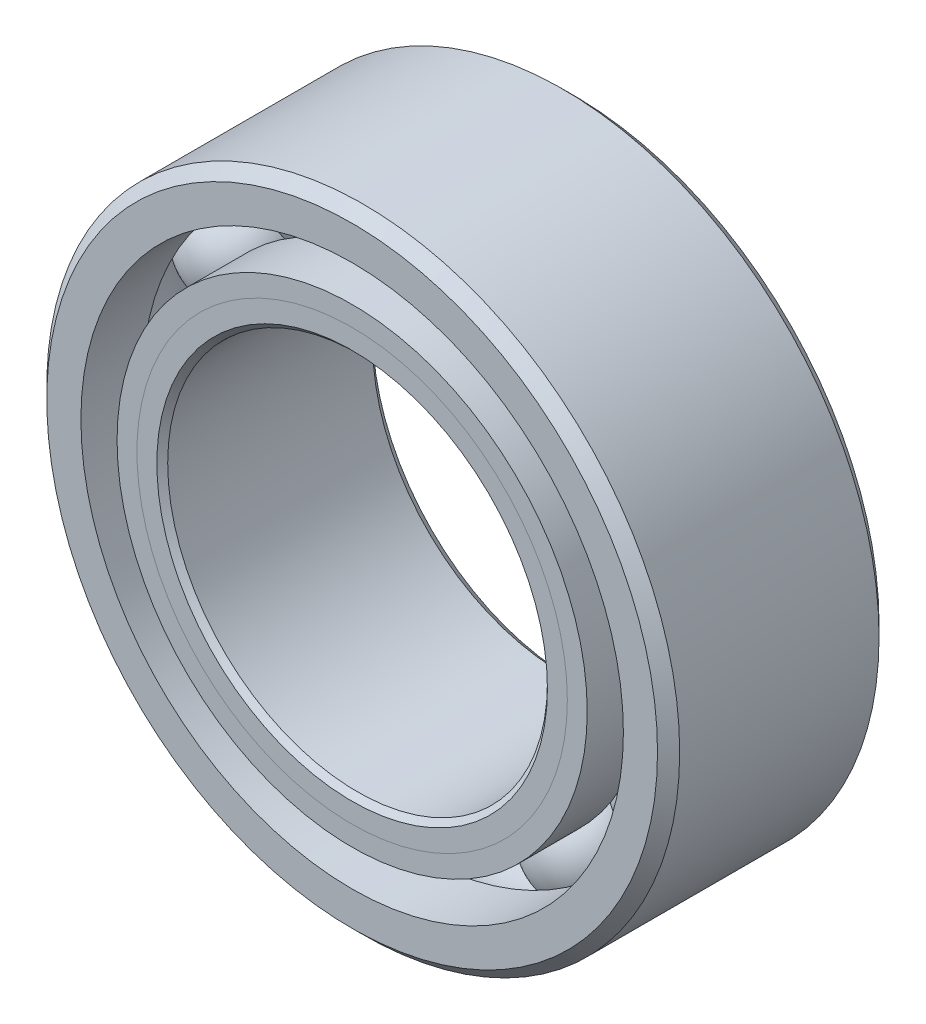
ISO-10303-21;
HEADER;
FILE_DESCRIPTION(('STEP AP214'),'2;1');
FILE_NAME('part.step','',(''),(''),'','','');
FILE_SCHEMA(('AUTOMOTIVE_DESIGN { 1 0 10303 214 1 1 1 1 }'));
ENDSEC;
DATA;
#1=APPLICATION_CONTEXT('core data for automotive mechanical design processes');
#2=APPLICATION_PROTOCOL_DEFINITION('international standard','automotive_design',2000,#1);
#3=PRODUCT_CONTEXT('',#1,'mechanical');
#4=PRODUCT('Part','Part','',(#3));
#5=PRODUCT_RELATED_PRODUCT_CATEGORY('part','',(#4));
#6=PRODUCT_DEFINITION_FORMATION('','',#4);
#7=PRODUCT_DEFINITION_CONTEXT('part definition',#1,'design');
#8=PRODUCT_DEFINITION('design','',#6,#7);
#9=PRODUCT_DEFINITION_SHAPE('','',#8);
#10=(LENGTH_UNIT() NAMED_UNIT(*) SI_UNIT(.MILLI.,.METRE.));
#11=(NAMED_UNIT(*) PLANE_ANGLE_UNIT() SI_UNIT($,.RADIAN.));
#12=(NAMED_UNIT(*) SI_UNIT($,.STERADIAN.) SOLID_ANGLE_UNIT());
#13=UNCERTAINTY_MEASURE_WITH_UNIT(LENGTH_MEASURE(1.E-05),#10,'distance_accuracy_value','');
#14=(GEOMETRIC_REPRESENTATION_CONTEXT(3) GLOBAL_UNCERTAINTY_ASSIGNED_CONTEXT((#13)) GLOBAL_UNIT_ASSIGNED_CONTEXT((#10,
#11,#12)) REPRESENTATION_CONTEXT('',''));
#15=CARTESIAN_POINT('',(0.,0.,0.));
#16=DIRECTION('',(0.,0.,1.));
#17=DIRECTION('',(1.,0.,0.));
#18=AXIS2_PLACEMENT_3D('',#15,#16,#17);
#19=CARTESIAN_POINT('',(-1.58749999999996,2.74963065701561,0.));
#20=DIRECTION('',(0.,0.,1.));
#21=DIRECTION('',(-0.499999999999989,0.866025403784445,0.));
#22=AXIS2_PLACEMENT_3D('',#19,#20,#21);
#23=SPHERICAL_SURFACE('',#22,0.657697880273631);
#24=CARTESIAN_POINT('',(-1.58749999999996,2.74963065701561,0.65769788027363));
#25=VERTEX_POINT('',#24);
#26=VERTEX_LOOP('',#25);
#27=FACE_BOUND('',#26,.T.);
#28=ADVANCED_FACE('F41',(#27),#23,.T.);
#29=CLOSED_SHELL('',(#28));
#30=MANIFOLD_SOLID_BREP('B2',#29);
#31=CARTESIAN_POINT('',(-2.74963065701557,1.58750000000003,0.));
#32=DIRECTION('',(0.,0.,1.));
#33=DIRECTION('',(-0.866025403784433,0.50000000000001,0.));
#34=AXIS2_PLACEMENT_3D('',#31,#32,#33);
#35=SPHERICAL_SURFACE('',#34,0.657697880273631);
#36=CARTESIAN_POINT('',(-2.74963065701557,1.58750000000003,0.65769788027363));
#37=VERTEX_POINT('',#36);
#38=VERTEX_LOOP('',#37);
#39=FACE_BOUND('',#38,.T.);
#40=ADVANCED_FACE('F73',(#39),#35,.T.);
#41=CLOSED_SHELL('',(#40));
#42=MANIFOLD_SOLID_BREP('B6',#41);
#43=CARTESIAN_POINT('',(-3.175,0.,0.));
#44=DIRECTION('',(0.,0.,1.));
#45=DIRECTION('',(-1.,0.,0.));
#46=AXIS2_PLACEMENT_3D('',#43,#44,#45);
#47=SPHERICAL_SURFACE('',#46,0.657697880273631);
#48=CARTESIAN_POINT('',(-3.175,0.,0.65769788027363));
#49=VERTEX_POINT('',#48);
#50=VERTEX_LOOP('',#49);
#51=FACE_BOUND('',#50,.T.);
#52=ADVANCED_FACE('F105',(#51),#47,.T.);
#53=CLOSED_SHELL('',(#52));
#54=MANIFOLD_SOLID_BREP('B37',#53);
#55=CARTESIAN_POINT('',(-2.74963065701561,-1.58749999999997,0.));
#56=DIRECTION('',(0.,0.,1.));
#57=DIRECTION('',(-0.866025403784443,-0.499999999999992,0.));
#58=AXIS2_PLACEMENT_3D('',#55,#56,#57);
#59=SPHERICAL_SURFACE('',#58,0.657697880273631);
#60=CARTESIAN_POINT('',(-2.74963065701561,-1.58749999999997,0.65769788027363));
#61=VERTEX_POINT('',#60);
#62=VERTEX_LOOP('',#61);
#63=FACE_BOUND('',#62,.T.);
#64=ADVANCED_FACE('F137',(#63),#59,.T.);
#65=CLOSED_SHELL('',(#64));
#66=MANIFOLD_SOLID_BREP('B69',#65);
#67=CARTESIAN_POINT('',(-1.58750000000002,-2.74963065701558,0.));
#68=DIRECTION('',(0.,0.,1.));
#69=DIRECTION('',(-0.500000000000007,-0.866025403784435,0.));
#70=AXIS2_PLACEMENT_3D('',#67,#68,#69);
#71=SPHERICAL_SURFACE('',#70,0.657697880273631);
#72=CARTESIAN_POINT('',(-1.58750000000002,-2.74963065701558,0.65769788027363));
#73=VERTEX_POINT('',#72);
#74=VERTEX_LOOP('',#73);
#75=FACE_BOUND('',#74,.T.);
#76=ADVANCED_FACE('F169',(#75),#71,.T.);
#77=CLOSED_SHELL('',(#76));
#78=MANIFOLD_SOLID_BREP('B101',#77);
#79=CARTESIAN_POINT('',(0.,-3.175,0.));
#80=DIRECTION('',(0.,0.,1.));
#81=DIRECTION('',(0.,-1.,0.));
#82=AXIS2_PLACEMENT_3D('',#79,#80,#81);
#83=SPHERICAL_SURFACE('',#82,0.657697880273631);
#84=CARTESIAN_POINT('',(0.,-3.175,0.65769788027363));
#85=VERTEX_POINT('',#84);
#86=VERTEX_LOOP('',#85);
#87=FACE_BOUND('',#86,.T.);
#88=ADVANCED_FACE('F201',(#87),#83,.T.);
#89=CLOSED_SHELL('',(#88));
#90=MANIFOLD_SOLID_BREP('B133',#89);
#91=CARTESIAN_POINT('',(1.58749999999998,-2.7496306570156,0.));
#92=DIRECTION('',(0.,0.,1.));
#93=DIRECTION('',(0.499999999999995,-0.866025403784442,0.));
#94=AXIS2_PLACEMENT_3D('',#91,#92,#93);
#95=SPHERICAL_SURFACE('',#94,0.657697880273631);
#96=CARTESIAN_POINT('',(1.58749999999998,-2.7496306570156,0.65769788027363));
#97=VERTEX_POINT('',#96);
#98=VERTEX_LOOP('',#97);
#99=FACE_BOUND('',#98,.T.);
#100=ADVANCED_FACE('F232',(#99),#95,.T.);
#101=CLOSED_SHELL('',(#100));
#102=MANIFOLD_SOLID_BREP('B165',#101);
#103=CARTESIAN_POINT('',(2.74963065701559,-1.58750000000001,0.));
#104=DIRECTION('',(0.,0.,1.));
#105=DIRECTION('',(0.866025403784436,-0.500000000000004,0.));
#106=AXIS2_PLACEMENT_3D('',#103,#104,#105);
#107=SPHERICAL_SURFACE('',#106,0.657697880273631);
#108=CARTESIAN_POINT('',(2.74963065701559,-1.58750000000001,0.65769788027363));
#109=VERTEX_POINT('',#108);
#110=VERTEX_LOOP('',#109);
#111=FACE_BOUND('',#110,.T.);
#112=ADVANCED_FACE('F263',(#111),#107,.T.);
#113=CLOSED_SHELL('',(#112));
#114=MANIFOLD_SOLID_BREP('B197',#113);
#115=CARTESIAN_POINT('',(3.175,0.,0.));
#116=DIRECTION('',(0.,0.,1.));
#117=DIRECTION('',(1.,0.,0.));
#118=AXIS2_PLACEMENT_3D('',#115,#116,#117);
#119=SPHERICAL_SURFACE('',#118,0.657697880273631);
#120=CARTESIAN_POINT('',(3.175,0.,0.65769788027363));
#121=VERTEX_POINT('',#120);
#122=VERTEX_LOOP('',#121);
#123=FACE_BOUND('',#122,.T.);
#124=ADVANCED_FACE('F294',(#123),#119,.T.);
#125=CLOSED_SHELL('',(#124));
#126=MANIFOLD_SOLID_BREP('B228',#125);
#127=CARTESIAN_POINT('',(2.7496306570156,1.58749999999999,0.));
#128=DIRECTION('',(0.,0.,1.));
#129=DIRECTION('',(0.86602540378444,0.499999999999998,0.));
#130=AXIS2_PLACEMENT_3D('',#127,#128,#129);
#131=SPHERICAL_SURFACE('',#130,0.657697880273631);
#132=CARTESIAN_POINT('',(2.7496306570156,1.58749999999999,0.65769788027363));
#133=VERTEX_POINT('',#132);
#134=VERTEX_LOOP('',#133);
#135=FACE_BOUND('',#134,.T.);
#136=ADVANCED_FACE('F326',(#135),#131,.T.);
#137=CLOSED_SHELL('',(#136));
#138=MANIFOLD_SOLID_BREP('B259',#137);
#139=CARTESIAN_POINT('',(1.5875,2.74963065701559,0.));
#140=DIRECTION('',(0.,0.,1.));
#141=DIRECTION('',(0.500000000000001,0.866025403784438,0.));
#142=AXIS2_PLACEMENT_3D('',#139,#140,#141);
#143=SPHERICAL_SURFACE('',#142,0.657697880273631);
#144=CARTESIAN_POINT('',(1.5875,2.74963065701559,0.65769788027363));
#145=VERTEX_POINT('',#144);
#146=VERTEX_LOOP('',#145);
#147=FACE_BOUND('',#146,.T.);
#148=ADVANCED_FACE('F357',(#147),#143,.T.);
#149=CLOSED_SHELL('',(#148));
#150=MANIFOLD_SOLID_BREP('B290',#149);
#151=CARTESIAN_POINT('',(0.,3.175,0.));
#152=DIRECTION('',(0.,0.,1.));
#153=DIRECTION('',(0.,1.,0.));
#154=AXIS2_PLACEMENT_3D('',#151,#152,#153);
#155=SPHERICAL_SURFACE('',#154,0.657697880273631);
#156=CARTESIAN_POINT('',(0.,3.175,0.65769788027363));
#157=VERTEX_POINT('',#156);
#158=VERTEX_LOOP('',#157);
#159=FACE_BOUND('',#158,.T.);
#160=ADVANCED_FACE('F391',(#159),#155,.T.);
#161=CLOSED_SHELL('',(#160));
#162=MANIFOLD_SOLID_BREP('B322',#161);
#163=CARTESIAN_POINT('',(0.,2.69874517278874,1.3890625));
#164=DIRECTION('',(0.,0.,-1.));
#165=DIRECTION('',(-1.,0.,0.));
#166=AXIS2_PLACEMENT_3D('',#163,#164,#165);
#167=PLANE('',#166);
#168=CARTESIAN_POINT('',(0.,0.,1.3890625));
#169=DIRECTION('',(0.,0.,1.));
#170=DIRECTION('',(1.,0.,0.));
#171=AXIS2_PLACEMENT_3D('',#168,#169,#170);
#172=CIRCLE('',#171,2.44927605986318);
#173=CARTESIAN_POINT('',(2.44927605986318,0.,1.3890625));
#174=VERTEX_POINT('',#173);
#175=EDGE_CURVE('E456',#174,#174,#172,.T.);
#176=ORIENTED_EDGE('',*,*,#175,.F.);
#177=EDGE_LOOP('',(#176));
#178=FACE_BOUND('',#177,.T.);
#179=CARTESIAN_POINT('',(0.,0.,1.3890625));
#180=DIRECTION('',(0.,0.,1.));
#181=DIRECTION('',(1.,0.,0.));
#182=AXIS2_PLACEMENT_3D('',#179,#180,#181);
#183=CIRCLE('',#182,2.69874517278874);
#184=CARTESIAN_POINT('',(2.69874517278874,0.,1.3890625));
#185=VERTEX_POINT('',#184);
#186=EDGE_CURVE('E390',#185,#185,#183,.T.);
#187=ORIENTED_EDGE('',*,*,#186,.T.);
#188=EDGE_LOOP('',(#187));
#189=FACE_BOUND('',#188,.T.);
#190=ADVANCED_FACE('F412',(#178,#189),#167,.F.);
#191=CARTESIAN_POINT('',(0.,0.,1.13959338707445));
#192=DIRECTION('',(0.,0.,1.));
#193=DIRECTION('',(1.,0.,0.));
#194=AXIS2_PLACEMENT_3D('',#191,#192,#193);
#195=CONICAL_SURFACE('',#194,2.44927605986318,0.78539816339745);
#196=ORIENTED_EDGE('',*,*,#186,.F.);
#197=EDGE_LOOP('',(#196));
#198=FACE_BOUND('',#197,.T.);
#199=CARTESIAN_POINT('',(0.,0.,1.13959338707445));
#200=DIRECTION('',(0.,0.,1.));
#201=DIRECTION('',(1.,0.,0.));
#202=AXIS2_PLACEMENT_3D('',#199,#200,#201);
#203=CIRCLE('',#202,2.44927605986318);
#204=CARTESIAN_POINT('',(2.44927605986318,0.,1.13959338707445));
#205=VERTEX_POINT('',#204);
#206=EDGE_CURVE('E419',#205,#205,#203,.T.);
#207=ORIENTED_EDGE('',*,*,#206,.T.);
#208=EDGE_LOOP('',(#207));
#209=FACE_BOUND('',#208,.T.);
#210=ADVANCED_FACE('F463',(#198,#209),#195,.T.);
#211=CARTESIAN_POINT('',(0.,0.,1.3890625));
#212=DIRECTION('',(0.,0.,1.));
#213=DIRECTION('',(1.,0.,0.));
#214=AXIS2_PLACEMENT_3D('',#211,#212,#213);
#215=CYLINDRICAL_SURFACE('',#214,2.44927605986318);
#216=ORIENTED_EDGE('',*,*,#206,.F.);
#217=EDGE_LOOP('',(#216));
#218=FACE_BOUND('',#217,.T.);
#219=CARTESIAN_POINT('',(0.,0.,0.));
#220=DIRECTION('',(0.,0.,1.));
#221=DIRECTION('',(1.,0.,0.));
#222=AXIS2_PLACEMENT_3D('',#219,#220,#221);
#223=CIRCLE('',#222,2.44927605986318);
#224=CARTESIAN_POINT('',(2.44927605986318,0.,0.));
#225=VERTEX_POINT('',#224);
#226=EDGE_CURVE('E425',#225,#225,#223,.T.);
#227=ORIENTED_EDGE('',*,*,#226,.T.);
#228=EDGE_LOOP('',(#227));
#229=FACE_BOUND('',#228,.T.);
#230=ADVANCED_FACE('F467',(#218,#229),#215,.T.);
#231=CARTESIAN_POINT('',(0.,2.44927605986318,0.));
#232=DIRECTION('',(0.,0.,-1.));
#233=DIRECTION('',(-1.,0.,0.));
#234=AXIS2_PLACEMENT_3D('',#231,#232,#233);
#235=PLANE('',#234);
#236=ORIENTED_EDGE('',*,*,#226,.F.);
#237=EDGE_LOOP('',(#236));
#238=FACE_BOUND('',#237,.T.);
#239=CARTESIAN_POINT('',(0.,0.,0.));
#240=DIRECTION('',(0.,0.,1.));
#241=DIRECTION('',(1.,0.,0.));
#242=AXIS2_PLACEMENT_3D('',#239,#240,#241);
#243=CIRCLE('',#242,2.51730211972637);
#244=CARTESIAN_POINT('',(2.51730211972637,0.,0.));
#245=VERTEX_POINT('',#244);
#246=EDGE_CURVE('E432',#245,#245,#243,.T.);
#247=ORIENTED_EDGE('',*,*,#246,.T.);
#248=EDGE_LOOP('',(#247));
#249=FACE_BOUND('',#248,.T.);
#250=ADVANCED_FACE('F472',(#238,#249),#235,.F.);
#251=CARTESIAN_POINT('',(0.,0.,0.));
#252=DIRECTION('',(0.,0.,1.));
#253=DIRECTION('',(1.,0.,0.));
#254=AXIS2_PLACEMENT_3D('',#251,#252,#253);
#255=TOROIDAL_SURFACE('',#254,3.175,0.65769788027363);
#256=ORIENTED_EDGE('',*,*,#246,.F.);
#257=EDGE_LOOP('',(#256));
#258=FACE_BOUND('',#257,.T.);
#259=CARTESIAN_POINT('',(0.,0.,-0.617361111111111));
#260=DIRECTION('',(0.,0.,1.));
#261=DIRECTION('',(1.,0.,0.));
#262=AXIS2_PLACEMENT_3D('',#259,#260,#261);
#263=CIRCLE('',#262,2.94821428571429);
#264=CARTESIAN_POINT('',(2.94821428571429,0.,-0.617361111111111));
#265=VERTEX_POINT('',#264);
#266=EDGE_CURVE('E437',#265,#265,#263,.T.);
#267=ORIENTED_EDGE('',*,*,#266,.T.);
#268=EDGE_LOOP('',(#267));
#269=FACE_BOUND('',#268,.T.);
#270=ADVANCED_FACE('F478',(#258,#269),#255,.F.);
#271=CARTESIAN_POINT('',(0.,0.,1.3890625));
#272=DIRECTION('',(0.,0.,1.));
#273=DIRECTION('',(1.,0.,0.));
#274=AXIS2_PLACEMENT_3D('',#271,#272,#273);
#275=CYLINDRICAL_SURFACE('',#274,2.94821428571429);
#276=ORIENTED_EDGE('',*,*,#266,.F.);
#277=EDGE_LOOP('',(#276));
#278=FACE_BOUND('',#277,.T.);
#279=CARTESIAN_POINT('',(0.,0.,-1.3890625));
#280=DIRECTION('',(0.,0.,1.));
#281=DIRECTION('',(1.,0.,0.));
#282=AXIS2_PLACEMENT_3D('',#279,#280,#281);
#283=CIRCLE('',#282,2.94821428571429);
#284=CARTESIAN_POINT('',(2.94821428571429,0.,-1.3890625));
#285=VERTEX_POINT('',#284);
#286=EDGE_CURVE('E441',#285,#285,#283,.T.);
#287=ORIENTED_EDGE('',*,*,#286,.T.);
#288=EDGE_LOOP('',(#287));
#289=FACE_BOUND('',#288,.T.);
#290=ADVANCED_FACE('F482',(#278,#289),#275,.T.);
#291=CARTESIAN_POINT('',(0.,2.52015625,-1.3890625));
#292=DIRECTION('',(0.,0.,1.));
#293=DIRECTION('',(1.,0.,0.));
#294=AXIS2_PLACEMENT_3D('',#291,#292,#293);
#295=PLANE('',#294);
#296=ORIENTED_EDGE('',*,*,#286,.F.);
#297=EDGE_LOOP('',(#296));
#298=FACE_BOUND('',#297,.T.);
#299=CARTESIAN_POINT('',(0.,0.,-1.3890625));
#300=DIRECTION('',(0.,0.,1.));
#301=DIRECTION('',(1.,0.,0.));
#302=AXIS2_PLACEMENT_3D('',#299,#300,#301);
#303=CIRCLE('',#302,2.52015625);
#304=CARTESIAN_POINT('',(2.52015625,0.,-1.3890625));
#305=VERTEX_POINT('',#304);
#306=EDGE_CURVE('E445',#305,#305,#303,.T.);
#307=ORIENTED_EDGE('',*,*,#306,.T.);
#308=EDGE_LOOP('',(#307));
#309=FACE_BOUND('',#308,.T.);
#310=ADVANCED_FACE('F486',(#298,#309),#295,.F.);
#311=CARTESIAN_POINT('',(0.,0.,-1.25015625));
#312=DIRECTION('',(0.,0.,-1.));
#313=DIRECTION('',(-1.,0.,0.));
#314=AXIS2_PLACEMENT_3D('',#311,#312,#313);
#315=CONICAL_SURFACE('',#314,2.38125,0.78539816339745);
#316=ORIENTED_EDGE('',*,*,#306,.F.);
#317=EDGE_LOOP('',(#316));
#318=FACE_BOUND('',#317,.T.);
#319=CARTESIAN_POINT('',(0.,0.,-1.25015625));
#320=DIRECTION('',(0.,0.,1.));
#321=DIRECTION('',(1.,0.,0.));
#322=AXIS2_PLACEMENT_3D('',#319,#320,#321);
#323=CIRCLE('',#322,2.38125);
#324=CARTESIAN_POINT('',(2.38125,0.,-1.25015625));
#325=VERTEX_POINT('',#324);
#326=EDGE_CURVE('E449',#325,#325,#323,.T.);
#327=ORIENTED_EDGE('',*,*,#326,.T.);
#328=EDGE_LOOP('',(#327));
#329=FACE_BOUND('',#328,.T.);
#330=ADVANCED_FACE('F490',(#318,#329),#315,.F.);
#331=CARTESIAN_POINT('',(0.,0.,1.3890625));
#332=DIRECTION('',(0.,0.,1.));
#333=DIRECTION('',(1.,0.,0.));
#334=AXIS2_PLACEMENT_3D('',#331,#332,#333);
#335=CYLINDRICAL_SURFACE('',#334,2.38125);
#336=ORIENTED_EDGE('',*,*,#326,.F.);
#337=EDGE_LOOP('',(#336));
#338=FACE_BOUND('',#337,.T.);
#339=CARTESIAN_POINT('',(0.,0.,1.32103644013682));
#340=DIRECTION('',(0.,0.,1.));
#341=DIRECTION('',(1.,0.,0.));
#342=AXIS2_PLACEMENT_3D('',#339,#340,#341);
#343=CIRCLE('',#342,2.38125);
#344=CARTESIAN_POINT('',(2.38125,0.,1.32103644013682));
#345=VERTEX_POINT('',#344);
#346=EDGE_CURVE('E453',#345,#345,#343,.T.);
#347=ORIENTED_EDGE('',*,*,#346,.T.);
#348=EDGE_LOOP('',(#347));
#349=FACE_BOUND('',#348,.T.);
#350=ADVANCED_FACE('F494',(#338,#349),#335,.F.);
#351=CARTESIAN_POINT('',(0.,0.,1.3890625));
#352=DIRECTION('',(0.,0.,1.));
#353=DIRECTION('',(1.,0.,0.));
#354=AXIS2_PLACEMENT_3D('',#351,#352,#353);
#355=CONICAL_SURFACE('',#354,2.44927605986318,0.785398163397453);
#356=ORIENTED_EDGE('',*,*,#346,.F.);
#357=EDGE_LOOP('',(#356));
#358=FACE_BOUND('',#357,.T.);
#359=ORIENTED_EDGE('',*,*,#175,.T.);
#360=EDGE_LOOP('',(#359));
#361=FACE_BOUND('',#360,.T.);
#362=ADVANCED_FACE('F460',(#358,#361),#355,.F.);
#363=CLOSED_SHELL('',(#190,#210,#230,#250,#270,#290,#310,#330,#350,#362));
#364=MANIFOLD_SOLID_BREP('B353',#363);
#365=CARTESIAN_POINT('',(0.,2.94821428571429,1.3890625));
#366=DIRECTION('',(0.,0.,-1.));
#367=DIRECTION('',(-1.,0.,0.));
#368=AXIS2_PLACEMENT_3D('',#365,#366,#367);
#369=PLANE('',#368);
#370=CARTESIAN_POINT('',(0.,0.,1.3890625));
#371=DIRECTION('',(0.,0.,1.));
#372=DIRECTION('',(1.,0.,0.));
#373=AXIS2_PLACEMENT_3D('',#370,#371,#372);
#374=CIRCLE('',#373,2.69874517278874);
#375=CARTESIAN_POINT('',(2.69874517278874,0.,1.3890625));
#376=VERTEX_POINT('',#375);
#377=EDGE_CURVE('E411',#376,#376,#374,.T.);
#378=ORIENTED_EDGE('',*,*,#377,.F.);
#379=EDGE_LOOP('',(#378));
#380=FACE_BOUND('',#379,.T.);
#381=CARTESIAN_POINT('',(0.,0.,1.3890625));
#382=DIRECTION('',(0.,0.,1.));
#383=DIRECTION('',(1.,0.,0.));
#384=AXIS2_PLACEMENT_3D('',#381,#382,#383);
#385=CIRCLE('',#384,2.94821428571429);
#386=CARTESIAN_POINT('',(2.94821428571429,0.,1.3890625));
#387=VERTEX_POINT('',#386);
#388=EDGE_CURVE('E617',#387,#387,#385,.T.);
#389=ORIENTED_EDGE('',*,*,#388,.T.);
#390=EDGE_LOOP('',(#389));
#391=FACE_BOUND('',#390,.T.);
#392=ADVANCED_FACE('F589',(#380,#391),#369,.F.);
#393=CARTESIAN_POINT('',(0.,0.,1.3890625));
#394=DIRECTION('',(0.,0.,1.));
#395=DIRECTION('',(1.,0.,0.));
#396=AXIS2_PLACEMENT_3D('',#393,#394,#395);
#397=CONICAL_SURFACE('',#396,2.69874517278874,0.78539816339745);
#398=CARTESIAN_POINT('',(0.,0.,1.13959338707445));
#399=DIRECTION('',(0.,0.,1.));
#400=DIRECTION('',(1.,0.,0.));
#401=AXIS2_PLACEMENT_3D('',#398,#399,#400);
#402=CIRCLE('',#401,2.44927605986318);
#403=CARTESIAN_POINT('',(2.44927605986318,0.,1.13959338707445));
#404=VERTEX_POINT('',#403);
#405=EDGE_CURVE('E596',#404,#404,#402,.T.);
#406=ORIENTED_EDGE('',*,*,#405,.F.);
#407=EDGE_LOOP('',(#406));
#408=FACE_BOUND('',#407,.T.);
#409=ORIENTED_EDGE('',*,*,#377,.T.);
#410=EDGE_LOOP('',(#409));
#411=FACE_BOUND('',#410,.T.);
#412=ADVANCED_FACE('F642',(#408,#411),#397,.F.);
#413=CARTESIAN_POINT('',(0.,0.,1.3890625));
#414=DIRECTION('',(0.,0.,1.));
#415=DIRECTION('',(1.,0.,0.));
#416=AXIS2_PLACEMENT_3D('',#413,#414,#415);
#417=CYLINDRICAL_SURFACE('',#416,2.44927605986318);
#418=CARTESIAN_POINT('',(0.,0.,0.));
#419=DIRECTION('',(0.,0.,1.));
#420=DIRECTION('',(1.,0.,0.));
#421=AXIS2_PLACEMENT_3D('',#418,#419,#420);
#422=CIRCLE('',#421,2.44927605986318);
#423=CARTESIAN_POINT('',(2.44927605986318,0.,0.));
#424=VERTEX_POINT('',#423);
#425=EDGE_CURVE('E602',#424,#424,#422,.T.);
#426=ORIENTED_EDGE('',*,*,#425,.F.);
#427=EDGE_LOOP('',(#426));
#428=FACE_BOUND('',#427,.T.);
#429=ORIENTED_EDGE('',*,*,#405,.T.);
#430=EDGE_LOOP('',(#429));
#431=FACE_BOUND('',#430,.T.);
#432=ADVANCED_FACE('F637',(#428,#431),#417,.F.);
#433=CARTESIAN_POINT('',(0.,2.44927605986318,0.));
#434=DIRECTION('',(0.,0.,1.));
#435=DIRECTION('',(1.,0.,0.));
#436=AXIS2_PLACEMENT_3D('',#433,#434,#435);
#437=PLANE('',#436);
#438=CARTESIAN_POINT('',(0.,0.,0.));
#439=DIRECTION('',(0.,0.,1.));
#440=DIRECTION('',(1.,0.,0.));
#441=AXIS2_PLACEMENT_3D('',#438,#439,#440);
#442=CIRCLE('',#441,2.51730211972637);
#443=CARTESIAN_POINT('',(2.51730211972637,0.,0.));
#444=VERTEX_POINT('',#443);
#445=EDGE_CURVE('E608',#444,#444,#442,.T.);
#446=ORIENTED_EDGE('',*,*,#445,.F.);
#447=EDGE_LOOP('',(#446));
#448=FACE_BOUND('',#447,.T.);
#449=ORIENTED_EDGE('',*,*,#425,.T.);
#450=EDGE_LOOP('',(#449));
#451=FACE_BOUND('',#450,.T.);
#452=ADVANCED_FACE('F631',(#448,#451),#437,.F.);
#453=CARTESIAN_POINT('',(0.,0.,0.));
#454=DIRECTION('',(0.,0.,1.));
#455=DIRECTION('',(1.,0.,0.));
#456=AXIS2_PLACEMENT_3D('',#453,#454,#455);
#457=TOROIDAL_SURFACE('',#456,3.175,0.657697880273631);
#458=CARTESIAN_POINT('',(0.,0.,0.617361111111111));
#459=DIRECTION('',(0.,0.,1.));
#460=DIRECTION('',(1.,0.,0.));
#461=AXIS2_PLACEMENT_3D('',#458,#459,#460);
#462=CIRCLE('',#461,2.94821428571429);
#463=CARTESIAN_POINT('',(2.94821428571429,0.,0.617361111111111));
#464=VERTEX_POINT('',#463);
#465=EDGE_CURVE('E614',#464,#464,#462,.T.);
#466=ORIENTED_EDGE('',*,*,#465,.F.);
#467=EDGE_LOOP('',(#466));
#468=FACE_BOUND('',#467,.T.);
#469=ORIENTED_EDGE('',*,*,#445,.T.);
#470=EDGE_LOOP('',(#469));
#471=FACE_BOUND('',#470,.T.);
#472=ADVANCED_FACE('F625',(#468,#471),#457,.F.);
#473=CARTESIAN_POINT('',(0.,0.,1.3890625));
#474=DIRECTION('',(0.,0.,1.));
#475=DIRECTION('',(1.,0.,0.));
#476=AXIS2_PLACEMENT_3D('',#473,#474,#475);
#477=CYLINDRICAL_SURFACE('',#476,2.94821428571429);
#478=ORIENTED_EDGE('',*,*,#388,.F.);
#479=EDGE_LOOP('',(#478));
#480=FACE_BOUND('',#479,.T.);
#481=ORIENTED_EDGE('',*,*,#465,.T.);
#482=EDGE_LOOP('',(#481));
#483=FACE_BOUND('',#482,.T.);
#484=ADVANCED_FACE('F622',(#480,#483),#477,.T.);
#485=CLOSED_SHELL('',(#392,#412,#432,#452,#472,#484));
#486=MANIFOLD_SOLID_BREP('B385',#485);
#487=CARTESIAN_POINT('',(0.,0.,1.25015625));
#488=DIRECTION('',(0.,0.,-1.));
#489=DIRECTION('',(-1.,0.,0.));
#490=AXIS2_PLACEMENT_3D('',#487,#488,#489);
#491=CONICAL_SURFACE('',#490,3.96875,0.785398163397445);
#492=CARTESIAN_POINT('',(0.,0.,1.3890625));
#493=DIRECTION('',(0.,0.,1.));
#494=DIRECTION('',(1.,0.,0.));
#495=AXIS2_PLACEMENT_3D('',#492,#493,#494);
#496=CIRCLE('',#495,3.82984375);
#497=CARTESIAN_POINT('',(3.82984375,0.,1.3890625));
#498=VERTEX_POINT('',#497);
#499=EDGE_CURVE('E727',#498,#498,#496,.T.);
#500=ORIENTED_EDGE('',*,*,#499,.F.);
#501=EDGE_LOOP('',(#500));
#502=FACE_BOUND('',#501,.T.);
#503=CARTESIAN_POINT('',(0.,0.,1.25015625));
#504=DIRECTION('',(0.,0.,1.));
#505=DIRECTION('',(1.,0.,0.));
#506=AXIS2_PLACEMENT_3D('',#503,#504,#505);
#507=CIRCLE('',#506,3.96875);
#508=CARTESIAN_POINT('',(3.96875,0.,1.25015625));
#509=VERTEX_POINT('',#508);
#510=EDGE_CURVE('E588',#509,#509,#507,.T.);
#511=ORIENTED_EDGE('',*,*,#510,.T.);
#512=EDGE_LOOP('',(#511));
#513=FACE_BOUND('',#512,.T.);
#514=ADVANCED_FACE('F691',(#502,#513),#491,.T.);
#515=CARTESIAN_POINT('',(0.,0.,1.3890625));
#516=DIRECTION('',(0.,0.,1.));
#517=DIRECTION('',(1.,0.,0.));
#518=AXIS2_PLACEMENT_3D('',#515,#516,#517);
#519=CYLINDRICAL_SURFACE('',#518,3.96875);
#520=ORIENTED_EDGE('',*,*,#510,.F.);
#521=EDGE_LOOP('',(#520));
#522=FACE_BOUND('',#521,.T.);
#523=CARTESIAN_POINT('',(0.,0.,-1.25015625));
#524=DIRECTION('',(0.,0.,1.));
#525=DIRECTION('',(1.,0.,0.));
#526=AXIS2_PLACEMENT_3D('',#523,#524,#525);
#527=CIRCLE('',#526,3.96875);
#528=CARTESIAN_POINT('',(3.96875,0.,-1.25015625));
#529=VERTEX_POINT('',#528);
#530=EDGE_CURVE('E698',#529,#529,#527,.T.);
#531=ORIENTED_EDGE('',*,*,#530,.T.);
#532=EDGE_LOOP('',(#531));
#533=FACE_BOUND('',#532,.T.);
#534=ADVANCED_FACE('F734',(#522,#533),#519,.T.);
#535=CARTESIAN_POINT('',(0.,0.,-1.3890625));
#536=DIRECTION('',(0.,0.,1.));
#537=DIRECTION('',(1.,0.,0.));
#538=AXIS2_PLACEMENT_3D('',#535,#536,#537);
#539=CONICAL_SURFACE('',#538,3.82984375,0.785398163397442);
#540=ORIENTED_EDGE('',*,*,#530,.F.);
#541=EDGE_LOOP('',(#540));
#542=FACE_BOUND('',#541,.T.);
#543=CARTESIAN_POINT('',(0.,0.,-1.3890625));
#544=DIRECTION('',(0.,0.,1.));
#545=DIRECTION('',(1.,0.,0.));
#546=AXIS2_PLACEMENT_3D('',#543,#544,#545);
#547=CIRCLE('',#546,3.82984375);
#548=CARTESIAN_POINT('',(3.82984375,0.,-1.3890625));
#549=VERTEX_POINT('',#548);
#550=EDGE_CURVE('E705',#549,#549,#547,.T.);
#551=ORIENTED_EDGE('',*,*,#550,.T.);
#552=EDGE_LOOP('',(#551));
#553=FACE_BOUND('',#552,.T.);
#554=ADVANCED_FACE('F738',(#542,#553),#539,.T.);
#555=CARTESIAN_POINT('',(0.,3.82984375,-1.3890625));
#556=DIRECTION('',(0.,0.,1.));
#557=DIRECTION('',(1.,0.,0.));
#558=AXIS2_PLACEMENT_3D('',#555,#556,#557);
#559=PLANE('',#558);
#560=ORIENTED_EDGE('',*,*,#550,.F.);
#561=EDGE_LOOP('',(#560));
#562=FACE_BOUND('',#561,.T.);
#563=CARTESIAN_POINT('',(0.,0.,-1.3890625));
#564=DIRECTION('',(0.,0.,1.));
#565=DIRECTION('',(1.,0.,0.));
#566=AXIS2_PLACEMENT_3D('',#563,#564,#565);
#567=CIRCLE('',#566,3.40178571428571);
#568=CARTESIAN_POINT('',(3.40178571428571,0.,-1.3890625));
#569=VERTEX_POINT('',#568);
#570=EDGE_CURVE('E711',#569,#569,#567,.T.);
#571=ORIENTED_EDGE('',*,*,#570,.T.);
#572=EDGE_LOOP('',(#571));
#573=FACE_BOUND('',#572,.T.);
#574=ADVANCED_FACE('F743',(#562,#573),#559,.F.);
#575=CARTESIAN_POINT('',(0.,0.,1.3890625));
#576=DIRECTION('',(0.,0.,1.));
#577=DIRECTION('',(1.,0.,0.));
#578=AXIS2_PLACEMENT_3D('',#575,#576,#577);
#579=CYLINDRICAL_SURFACE('',#578,3.40178571428571);
#580=ORIENTED_EDGE('',*,*,#570,.F.);
#581=EDGE_LOOP('',(#580));
#582=FACE_BOUND('',#581,.T.);
#583=CARTESIAN_POINT('',(0.,0.,-0.617361111111111));
#584=DIRECTION('',(0.,0.,1.));
#585=DIRECTION('',(1.,0.,0.));
#586=AXIS2_PLACEMENT_3D('',#583,#584,#585);
#587=CIRCLE('',#586,3.40178571428571);
#588=CARTESIAN_POINT('',(3.40178571428571,0.,-0.617361111111111));
#589=VERTEX_POINT('',#588);
#590=EDGE_CURVE('E717',#589,#589,#587,.T.);
#591=ORIENTED_EDGE('',*,*,#590,.T.);
#592=EDGE_LOOP('',(#591));
#593=FACE_BOUND('',#592,.T.);
#594=ADVANCED_FACE('F749',(#582,#593),#579,.F.);
#595=CARTESIAN_POINT('',(0.,0.,0.));
#596=DIRECTION('',(0.,0.,1.));
#597=DIRECTION('',(1.,0.,0.));
#598=AXIS2_PLACEMENT_3D('',#595,#596,#597);
#599=TOROIDAL_SURFACE('',#598,3.175,0.657697880273631);
#600=ORIENTED_EDGE('',*,*,#590,.F.);
#601=EDGE_LOOP('',(#600));
#602=FACE_BOUND('',#601,.T.);
#603=CARTESIAN_POINT('',(0.,0.,0.617361111111111));
#604=DIRECTION('',(0.,0.,1.));
#605=DIRECTION('',(1.,0.,0.));
#606=AXIS2_PLACEMENT_3D('',#603,#604,#605);
#607=CIRCLE('',#606,3.40178571428571);
#608=CARTESIAN_POINT('',(3.40178571428571,0.,0.617361111111111));
#609=VERTEX_POINT('',#608);
#610=EDGE_CURVE('E720',#609,#609,#607,.T.);
#611=ORIENTED_EDGE('',*,*,#610,.T.);
#612=EDGE_LOOP('',(#611));
#613=FACE_BOUND('',#612,.T.);
#614=ADVANCED_FACE('F753',(#602,#613),#599,.F.);
#615=CARTESIAN_POINT('',(0.,0.,1.3890625));
#616=DIRECTION('',(0.,0.,1.));
#617=DIRECTION('',(1.,0.,0.));
#618=AXIS2_PLACEMENT_3D('',#615,#616,#617);
#619=CYLINDRICAL_SURFACE('',#618,3.40178571428571);
#620=ORIENTED_EDGE('',*,*,#610,.F.);
#621=EDGE_LOOP('',(#620));
#622=FACE_BOUND('',#621,.T.);
#623=CARTESIAN_POINT('',(0.,0.,1.3890625));
#624=DIRECTION('',(0.,0.,1.));
#625=DIRECTION('',(1.,0.,0.));
#626=AXIS2_PLACEMENT_3D('',#623,#624,#625);
#627=CIRCLE('',#626,3.40178571428571);
#628=CARTESIAN_POINT('',(3.40178571428571,0.,1.3890625));
#629=VERTEX_POINT('',#628);
#630=EDGE_CURVE('E724',#629,#629,#627,.T.);
#631=ORIENTED_EDGE('',*,*,#630,.T.);
#632=EDGE_LOOP('',(#631));
#633=FACE_BOUND('',#632,.T.);
#634=ADVANCED_FACE('F757',(#622,#633),#619,.F.);
#635=CARTESIAN_POINT('',(0.,3.82984375,1.3890625));
#636=DIRECTION('',(0.,0.,-1.));
#637=DIRECTION('',(-1.,0.,0.));
#638=AXIS2_PLACEMENT_3D('',#635,#636,#637);
#639=PLANE('',#638);
#640=ORIENTED_EDGE('',*,*,#630,.F.);
#641=EDGE_LOOP('',(#640));
#642=FACE_BOUND('',#641,.T.);
#643=ORIENTED_EDGE('',*,*,#499,.T.);
#644=EDGE_LOOP('',(#643));
#645=FACE_BOUND('',#644,.T.);
#646=ADVANCED_FACE('F731',(#642,#645),#639,.F.);
#647=CLOSED_SHELL('',(#514,#534,#554,#574,#594,#614,#634,#646));
#648=MANIFOLD_SOLID_BREP('B406',#647);
#649=ADVANCED_BREP_SHAPE_REPRESENTATION('',(#18,#30,#42,#54,#66,#78,#90,#102,#114,#126,#138,
#150,#162,#364,#486,#648),#14);
#650=SHAPE_DEFINITION_REPRESENTATION(#9,#649);
ENDSEC;
END-ISO-10303-21;
